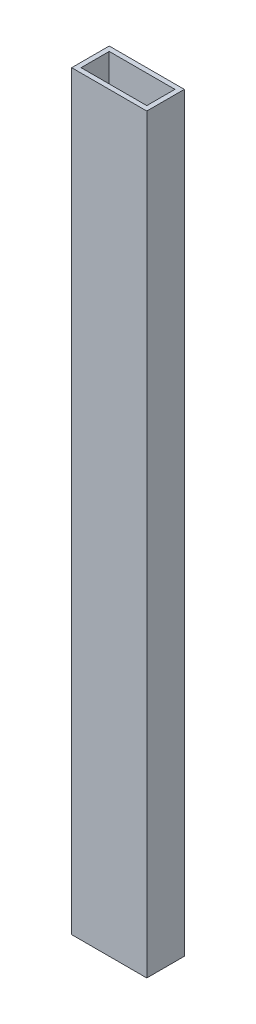
ISO-10303-21;
HEADER;
FILE_DESCRIPTION(('STEP AP214'),'2;1');
FILE_NAME('part.step','',(''),(''),'','','');
FILE_SCHEMA(('AUTOMOTIVE_DESIGN { 1 0 10303 214 1 1 1 1 }'));
ENDSEC;
DATA;
#1=APPLICATION_CONTEXT('core data for automotive mechanical design processes');
#2=APPLICATION_PROTOCOL_DEFINITION('international standard','automotive_design',2000,#1);
#3=PRODUCT_CONTEXT('',#1,'mechanical');
#4=PRODUCT('Part','Part','',(#3));
#5=PRODUCT_RELATED_PRODUCT_CATEGORY('part','',(#4));
#6=PRODUCT_DEFINITION_FORMATION('','',#4);
#7=PRODUCT_DEFINITION_CONTEXT('part definition',#1,'design');
#8=PRODUCT_DEFINITION('design','',#6,#7);
#9=PRODUCT_DEFINITION_SHAPE('','',#8);
#10=(LENGTH_UNIT() NAMED_UNIT(*) SI_UNIT(.MILLI.,.METRE.));
#11=(NAMED_UNIT(*) PLANE_ANGLE_UNIT() SI_UNIT($,.RADIAN.));
#12=(NAMED_UNIT(*) SI_UNIT($,.STERADIAN.) SOLID_ANGLE_UNIT());
#13=UNCERTAINTY_MEASURE_WITH_UNIT(LENGTH_MEASURE(1.E-05),#10,'distance_accuracy_value','');
#14=(GEOMETRIC_REPRESENTATION_CONTEXT(3) GLOBAL_UNCERTAINTY_ASSIGNED_CONTEXT((#13)) GLOBAL_UNIT_ASSIGNED_CONTEXT((#10,
#11,#12)) REPRESENTATION_CONTEXT('',''));
#15=CARTESIAN_POINT('',(0.,0.,0.));
#16=DIRECTION('',(0.,0.,1.));
#17=DIRECTION('',(1.,0.,0.));
#18=AXIS2_PLACEMENT_3D('',#15,#16,#17);
#19=CARTESIAN_POINT('',(0.,508.,0.));
#20=DIRECTION('',(0.,-1.,0.));
#21=DIRECTION('',(0.,0.,-1.));
#22=AXIS2_PLACEMENT_3D('',#19,#20,#21);
#23=PLANE('',#22);
#24=DIRECTION('',(0.,0.,-1.));
#25=VECTOR('',#24,1.);
#26=CARTESIAN_POINT('',(25.4,508.,12.7));
#27=LINE('',#26,#25);
#28=CARTESIAN_POINT('',(25.4,508.,12.7));
#29=VERTEX_POINT('',#28);
#30=CARTESIAN_POINT('',(25.4,508.,-12.7));
#31=VERTEX_POINT('',#30);
#32=EDGE_CURVE('E159',#29,#31,#27,.T.);
#33=ORIENTED_EDGE('',*,*,#32,.T.);
#34=DIRECTION('',(-1.,0.,0.));
#35=VECTOR('',#34,1.);
#36=CARTESIAN_POINT('',(-25.4,508.,-12.7));
#37=LINE('',#36,#35);
#38=CARTESIAN_POINT('',(-25.4,508.,-12.7));
#39=VERTEX_POINT('',#38);
#40=EDGE_CURVE('E163',#31,#39,#37,.T.);
#41=ORIENTED_EDGE('',*,*,#40,.T.);
#42=DIRECTION('',(0.,0.,1.));
#43=VECTOR('',#42,1.);
#44=CARTESIAN_POINT('',(-25.4,508.,12.7));
#45=LINE('',#44,#43);
#46=CARTESIAN_POINT('',(-25.4,508.,12.7));
#47=VERTEX_POINT('',#46);
#48=EDGE_CURVE('E167',#39,#47,#45,.T.);
#49=ORIENTED_EDGE('',*,*,#48,.T.);
#50=DIRECTION('',(1.,0.,0.));
#51=VECTOR('',#50,1.);
#52=CARTESIAN_POINT('',(-25.4,508.,12.7));
#53=LINE('',#52,#51);
#54=EDGE_CURVE('E170',#47,#29,#53,.T.);
#55=ORIENTED_EDGE('',*,*,#54,.T.);
#56=EDGE_LOOP('',(#33,#41,#49,#55));
#57=FACE_BOUND('',#56,.T.);
#58=DIRECTION('',(0.,0.,1.));
#59=VECTOR('',#58,1.);
#60=CARTESIAN_POINT('',(-22.225,508.,9.52499999999999));
#61=LINE('',#60,#59);
#62=CARTESIAN_POINT('',(-22.225,508.,-9.52500000000002));
#63=VERTEX_POINT('',#62);
#64=CARTESIAN_POINT('',(-22.225,508.,9.52499999999999));
#65=VERTEX_POINT('',#64);
#66=EDGE_CURVE('E111',#63,#65,#61,.T.);
#67=ORIENTED_EDGE('',*,*,#66,.F.);
#68=DIRECTION('',(-1.,0.,0.));
#69=VECTOR('',#68,1.);
#70=CARTESIAN_POINT('',(-22.225,508.,-9.52500000000002));
#71=LINE('',#70,#69);
#72=CARTESIAN_POINT('',(22.225,508.,-9.52500000000001));
#73=VERTEX_POINT('',#72);
#74=EDGE_CURVE('E137',#73,#63,#71,.T.);
#75=ORIENTED_EDGE('',*,*,#74,.F.);
#76=DIRECTION('',(0.,0.,-1.));
#77=VECTOR('',#76,1.);
#78=CARTESIAN_POINT('',(22.225,508.,9.52499999999999));
#79=LINE('',#78,#77);
#80=CARTESIAN_POINT('',(22.225,508.,9.52499999999999));
#81=VERTEX_POINT('',#80);
#82=EDGE_CURVE('E133',#81,#73,#79,.T.);
#83=ORIENTED_EDGE('',*,*,#82,.F.);
#84=DIRECTION('',(1.,0.,0.));
#85=VECTOR('',#84,1.);
#86=CARTESIAN_POINT('',(-22.225,508.,9.52499999999999));
#87=LINE('',#86,#85);
#88=EDGE_CURVE('E120',#65,#81,#87,.T.);
#89=ORIENTED_EDGE('',*,*,#88,.F.);
#90=EDGE_LOOP('',(#67,#75,#83,#89));
#91=FACE_BOUND('',#90,.T.);
#92=ADVANCED_FACE('F45',(#57,#91),#23,.F.);
#93=CARTESIAN_POINT('',(0.,0.,0.));
#94=DIRECTION('',(0.,-1.,0.));
#95=DIRECTION('',(0.,0.,-1.));
#96=AXIS2_PLACEMENT_3D('',#93,#94,#95);
#97=PLANE('',#96);
#98=DIRECTION('',(0.,0.,-1.));
#99=VECTOR('',#98,1.);
#100=CARTESIAN_POINT('',(25.4,0.,12.7));
#101=LINE('',#100,#99);
#102=CARTESIAN_POINT('',(25.4,0.,12.7));
#103=VERTEX_POINT('',#102);
#104=CARTESIAN_POINT('',(25.4,0.,-12.7));
#105=VERTEX_POINT('',#104);
#106=EDGE_CURVE('E129',#103,#105,#101,.T.);
#107=ORIENTED_EDGE('',*,*,#106,.F.);
#108=DIRECTION('',(1.,0.,0.));
#109=VECTOR('',#108,1.);
#110=CARTESIAN_POINT('',(-25.4,0.,12.7));
#111=LINE('',#110,#109);
#112=CARTESIAN_POINT('',(-25.4,0.,12.7));
#113=VERTEX_POINT('',#112);
#114=EDGE_CURVE('E164',#113,#103,#111,.T.);
#115=ORIENTED_EDGE('',*,*,#114,.F.);
#116=DIRECTION('',(0.,0.,1.));
#117=VECTOR('',#116,1.);
#118=CARTESIAN_POINT('',(-25.4,0.,12.7));
#119=LINE('',#118,#117);
#120=CARTESIAN_POINT('',(-25.4,0.,-12.7));
#121=VERTEX_POINT('',#120);
#122=EDGE_CURVE('E180',#121,#113,#119,.T.);
#123=ORIENTED_EDGE('',*,*,#122,.F.);
#124=DIRECTION('',(-1.,0.,0.));
#125=VECTOR('',#124,1.);
#126=CARTESIAN_POINT('',(-25.4,0.,-12.7));
#127=LINE('',#126,#125);
#128=EDGE_CURVE('E177',#105,#121,#127,.T.);
#129=ORIENTED_EDGE('',*,*,#128,.F.);
#130=EDGE_LOOP('',(#107,#115,#123,#129));
#131=FACE_BOUND('',#130,.T.);
#132=DIRECTION('',(-1.,0.,0.));
#133=VECTOR('',#132,1.);
#134=CARTESIAN_POINT('',(-22.225,0.,-9.52500000000002));
#135=LINE('',#134,#133);
#136=CARTESIAN_POINT('',(22.225,0.,-9.52500000000001));
#137=VERTEX_POINT('',#136);
#138=CARTESIAN_POINT('',(-22.225,0.,-9.52500000000002));
#139=VERTEX_POINT('',#138);
#140=EDGE_CURVE('E121',#137,#139,#135,.T.);
#141=ORIENTED_EDGE('',*,*,#140,.T.);
#142=DIRECTION('',(0.,0.,1.));
#143=VECTOR('',#142,1.);
#144=CARTESIAN_POINT('',(-22.225,0.,9.52499999999999));
#145=LINE('',#144,#143);
#146=CARTESIAN_POINT('',(-22.225,0.,9.52499999999999));
#147=VERTEX_POINT('',#146);
#148=EDGE_CURVE('E69',#139,#147,#145,.T.);
#149=ORIENTED_EDGE('',*,*,#148,.T.);
#150=DIRECTION('',(1.,0.,0.));
#151=VECTOR('',#150,1.);
#152=CARTESIAN_POINT('',(-22.225,0.,9.52499999999999));
#153=LINE('',#152,#151);
#154=CARTESIAN_POINT('',(22.225,0.,9.52499999999999));
#155=VERTEX_POINT('',#154);
#156=EDGE_CURVE('E127',#147,#155,#153,.T.);
#157=ORIENTED_EDGE('',*,*,#156,.T.);
#158=DIRECTION('',(0.,0.,-1.));
#159=VECTOR('',#158,1.);
#160=CARTESIAN_POINT('',(22.225,0.,9.52499999999999));
#161=LINE('',#160,#159);
#162=EDGE_CURVE('E146',#155,#137,#161,.T.);
#163=ORIENTED_EDGE('',*,*,#162,.T.);
#164=EDGE_LOOP('',(#141,#149,#157,#163));
#165=FACE_BOUND('',#164,.T.);
#166=ADVANCED_FACE('F203',(#131,#165),#97,.T.);
#167=CARTESIAN_POINT('',(25.4,508.,12.7));
#168=DIRECTION('',(-1.,0.,0.));
#169=DIRECTION('',(0.,0.,1.));
#170=AXIS2_PLACEMENT_3D('',#167,#168,#169);
#171=PLANE('',#170);
#172=ORIENTED_EDGE('',*,*,#106,.T.);
#173=DIRECTION('',(0.,-1.,0.));
#174=VECTOR('',#173,1.);
#175=CARTESIAN_POINT('',(25.4,508.,-12.7));
#176=LINE('',#175,#174);
#177=EDGE_CURVE('E11',#31,#105,#176,.T.);
#178=ORIENTED_EDGE('',*,*,#177,.F.);
#179=ORIENTED_EDGE('',*,*,#32,.F.);
#180=DIRECTION('',(0.,-1.,0.));
#181=VECTOR('',#180,1.);
#182=CARTESIAN_POINT('',(25.4,508.,12.7));
#183=LINE('',#182,#181);
#184=EDGE_CURVE('E173',#29,#103,#183,.T.);
#185=ORIENTED_EDGE('',*,*,#184,.T.);
#186=EDGE_LOOP('',(#172,#178,#179,#185));
#187=FACE_BOUND('',#186,.T.);
#188=ADVANCED_FACE('F47',(#187),#171,.F.);
#189=CARTESIAN_POINT('',(-25.4,508.,-12.7));
#190=DIRECTION('',(0.,0.,1.));
#191=DIRECTION('',(1.,0.,0.));
#192=AXIS2_PLACEMENT_3D('',#189,#190,#191);
#193=PLANE('',#192);
#194=ORIENTED_EDGE('',*,*,#128,.T.);
#195=DIRECTION('',(0.,-1.,0.));
#196=VECTOR('',#195,1.);
#197=CARTESIAN_POINT('',(-25.4,508.,-12.7));
#198=LINE('',#197,#196);
#199=EDGE_CURVE('E54',#39,#121,#198,.T.);
#200=ORIENTED_EDGE('',*,*,#199,.F.);
#201=ORIENTED_EDGE('',*,*,#40,.F.);
#202=ORIENTED_EDGE('',*,*,#177,.T.);
#203=EDGE_LOOP('',(#194,#200,#201,#202));
#204=FACE_BOUND('',#203,.T.);
#205=ADVANCED_FACE('F213',(#204),#193,.F.);
#206=CARTESIAN_POINT('',(-25.4,508.,12.7));
#207=DIRECTION('',(1.,0.,0.));
#208=DIRECTION('',(0.,0.,-1.));
#209=AXIS2_PLACEMENT_3D('',#206,#207,#208);
#210=PLANE('',#209);
#211=ORIENTED_EDGE('',*,*,#122,.T.);
#212=DIRECTION('',(0.,-1.,0.));
#213=VECTOR('',#212,1.);
#214=CARTESIAN_POINT('',(-25.4,508.,12.7));
#215=LINE('',#214,#213);
#216=EDGE_CURVE('E188',#47,#113,#215,.T.);
#217=ORIENTED_EDGE('',*,*,#216,.F.);
#218=ORIENTED_EDGE('',*,*,#48,.F.);
#219=ORIENTED_EDGE('',*,*,#199,.T.);
#220=EDGE_LOOP('',(#211,#217,#218,#219));
#221=FACE_BOUND('',#220,.T.);
#222=ADVANCED_FACE('F197',(#221),#210,.F.);
#223=CARTESIAN_POINT('',(-25.4,508.,12.7));
#224=DIRECTION('',(0.,0.,-1.));
#225=DIRECTION('',(-1.,0.,0.));
#226=AXIS2_PLACEMENT_3D('',#223,#224,#225);
#227=PLANE('',#226);
#228=ORIENTED_EDGE('',*,*,#114,.T.);
#229=ORIENTED_EDGE('',*,*,#184,.F.);
#230=ORIENTED_EDGE('',*,*,#54,.F.);
#231=ORIENTED_EDGE('',*,*,#216,.T.);
#232=EDGE_LOOP('',(#228,#229,#230,#231));
#233=FACE_BOUND('',#232,.T.);
#234=ADVANCED_FACE('F207',(#233),#227,.F.);
#235=CARTESIAN_POINT('',(-22.225,508.,9.52499999999999));
#236=DIRECTION('',(1.,0.,0.));
#237=DIRECTION('',(0.,0.,-1.));
#238=AXIS2_PLACEMENT_3D('',#235,#236,#237);
#239=PLANE('',#238);
#240=ORIENTED_EDGE('',*,*,#148,.F.);
#241=DIRECTION('',(0.,-1.,0.));
#242=VECTOR('',#241,1.);
#243=CARTESIAN_POINT('',(-22.225,508.,-9.52500000000002));
#244=LINE('',#243,#242);
#245=EDGE_CURVE('E115',#63,#139,#244,.T.);
#246=ORIENTED_EDGE('',*,*,#245,.F.);
#247=ORIENTED_EDGE('',*,*,#66,.T.);
#248=DIRECTION('',(0.,-1.,0.));
#249=VECTOR('',#248,1.);
#250=CARTESIAN_POINT('',(-22.225,508.,9.52499999999999));
#251=LINE('',#250,#249);
#252=EDGE_CURVE('E114',#65,#147,#251,.T.);
#253=ORIENTED_EDGE('',*,*,#252,.T.);
#254=EDGE_LOOP('',(#240,#246,#247,#253));
#255=FACE_BOUND('',#254,.T.);
#256=ADVANCED_FACE('F113',(#255),#239,.T.);
#257=CARTESIAN_POINT('',(-22.225,508.,9.52499999999999));
#258=DIRECTION('',(0.,0.,-1.));
#259=DIRECTION('',(-1.,0.,0.));
#260=AXIS2_PLACEMENT_3D('',#257,#258,#259);
#261=PLANE('',#260);
#262=ORIENTED_EDGE('',*,*,#156,.F.);
#263=ORIENTED_EDGE('',*,*,#252,.F.);
#264=ORIENTED_EDGE('',*,*,#88,.T.);
#265=DIRECTION('',(0.,-1.,0.));
#266=VECTOR('',#265,1.);
#267=CARTESIAN_POINT('',(22.225,508.,9.52499999999999));
#268=LINE('',#267,#266);
#269=EDGE_CURVE('E130',#81,#155,#268,.T.);
#270=ORIENTED_EDGE('',*,*,#269,.T.);
#271=EDGE_LOOP('',(#262,#263,#264,#270));
#272=FACE_BOUND('',#271,.T.);
#273=ADVANCED_FACE('F124',(#272),#261,.T.);
#274=CARTESIAN_POINT('',(22.225,508.,9.52499999999999));
#275=DIRECTION('',(-1.,0.,0.));
#276=DIRECTION('',(0.,0.,1.));
#277=AXIS2_PLACEMENT_3D('',#274,#275,#276);
#278=PLANE('',#277);
#279=ORIENTED_EDGE('',*,*,#162,.F.);
#280=ORIENTED_EDGE('',*,*,#269,.F.);
#281=ORIENTED_EDGE('',*,*,#82,.T.);
#282=DIRECTION('',(0.,-1.,0.));
#283=VECTOR('',#282,1.);
#284=CARTESIAN_POINT('',(22.225,508.,-9.52500000000001));
#285=LINE('',#284,#283);
#286=EDGE_CURVE('E61',#73,#137,#285,.T.);
#287=ORIENTED_EDGE('',*,*,#286,.T.);
#288=EDGE_LOOP('',(#279,#280,#281,#287));
#289=FACE_BOUND('',#288,.T.);
#290=ADVANCED_FACE('F236',(#289),#278,.T.);
#291=CARTESIAN_POINT('',(-22.225,508.,-9.52500000000002));
#292=DIRECTION('',(0.,0.,1.));
#293=DIRECTION('',(1.,0.,0.));
#294=AXIS2_PLACEMENT_3D('',#291,#292,#293);
#295=PLANE('',#294);
#296=ORIENTED_EDGE('',*,*,#140,.F.);
#297=ORIENTED_EDGE('',*,*,#286,.F.);
#298=ORIENTED_EDGE('',*,*,#74,.T.);
#299=ORIENTED_EDGE('',*,*,#245,.T.);
#300=EDGE_LOOP('',(#296,#297,#298,#299));
#301=FACE_BOUND('',#300,.T.);
#302=ADVANCED_FACE('F240',(#301),#295,.T.);
#303=CLOSED_SHELL('',(#92,#166,#188,#205,#222,#234,#256,#273,#290,#302));
#304=MANIFOLD_SOLID_BREP('B2',#303);
#305=ADVANCED_BREP_SHAPE_REPRESENTATION('',(#18,#304),#14);
#306=SHAPE_DEFINITION_REPRESENTATION(#9,#305);
ENDSEC;
END-ISO-10303-21;
